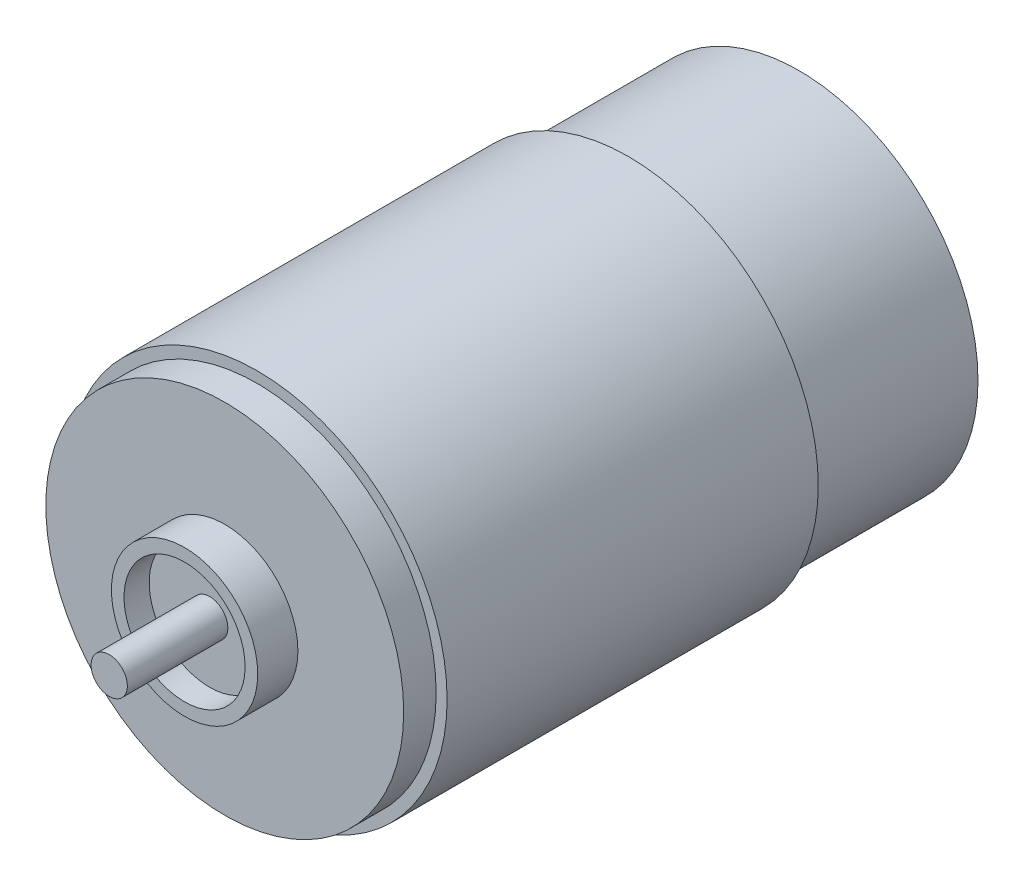
ISO-10303-21;
HEADER;
FILE_DESCRIPTION(('STEP AP214'),'2;1');
FILE_NAME('part.step','',(''),(''),'','','');
FILE_SCHEMA(('AUTOMOTIVE_DESIGN { 1 0 10303 214 1 1 1 1 }'));
ENDSEC;
DATA;
#1=APPLICATION_CONTEXT('core data for automotive mechanical design processes');
#2=APPLICATION_PROTOCOL_DEFINITION('international standard','automotive_design',2000,#1);
#3=PRODUCT_CONTEXT('',#1,'mechanical');
#4=PRODUCT('Part','Part','',(#3));
#5=PRODUCT_RELATED_PRODUCT_CATEGORY('part','',(#4));
#6=PRODUCT_DEFINITION_FORMATION('','',#4);
#7=PRODUCT_DEFINITION_CONTEXT('part definition',#1,'design');
#8=PRODUCT_DEFINITION('design','',#6,#7);
#9=PRODUCT_DEFINITION_SHAPE('','',#8);
#10=(LENGTH_UNIT() NAMED_UNIT(*) SI_UNIT(.MILLI.,.METRE.));
#11=(NAMED_UNIT(*) PLANE_ANGLE_UNIT() SI_UNIT($,.RADIAN.));
#12=(NAMED_UNIT(*) SI_UNIT($,.STERADIAN.) SOLID_ANGLE_UNIT());
#13=UNCERTAINTY_MEASURE_WITH_UNIT(LENGTH_MEASURE(1.E-05),#10,'distance_accuracy_value','');
#14=(GEOMETRIC_REPRESENTATION_CONTEXT(3) GLOBAL_UNCERTAINTY_ASSIGNED_CONTEXT((#13)) GLOBAL_UNIT_ASSIGNED_CONTEXT((#10,
#11,#12)) REPRESENTATION_CONTEXT('',''));
#15=CARTESIAN_POINT('',(0.,0.,0.));
#16=DIRECTION('',(0.,0.,1.));
#17=DIRECTION('',(1.,0.,0.));
#18=AXIS2_PLACEMENT_3D('',#15,#16,#17);
#19=CARTESIAN_POINT('',(0.,0.,36.94));
#20=DIRECTION('',(0.,0.,-1.));
#21=DIRECTION('',(-1.,0.,0.));
#22=AXIS2_PLACEMENT_3D('',#19,#20,#21);
#23=CYLINDRICAL_SURFACE('',#22,18.9);
#24=CARTESIAN_POINT('',(0.,0.,36.94));
#25=DIRECTION('',(0.,0.,1.));
#26=DIRECTION('',(1.,0.,0.));
#27=AXIS2_PLACEMENT_3D('',#24,#25,#26);
#28=CIRCLE('',#27,18.9);
#29=CARTESIAN_POINT('',(18.9,0.,36.94));
#30=VERTEX_POINT('',#29);
#31=EDGE_CURVE('E39',#30,#30,#28,.T.);
#32=ORIENTED_EDGE('',*,*,#31,.F.);
#33=EDGE_LOOP('',(#32));
#34=FACE_BOUND('',#33,.T.);
#35=CARTESIAN_POINT('',(0.,0.,0.));
#36=DIRECTION('',(0.,0.,1.));
#37=DIRECTION('',(1.,0.,0.));
#38=AXIS2_PLACEMENT_3D('',#35,#36,#37);
#39=CIRCLE('',#38,18.9);
#40=CARTESIAN_POINT('',(18.9,0.,0.));
#41=VERTEX_POINT('',#40);
#42=EDGE_CURVE('E43',#41,#41,#39,.T.);
#43=ORIENTED_EDGE('',*,*,#42,.T.);
#44=EDGE_LOOP('',(#43));
#45=FACE_BOUND('',#44,.T.);
#46=ADVANCED_FACE('F33',(#34,#45),#23,.T.);
#47=CARTESIAN_POINT('',(0.,0.,36.94));
#48=DIRECTION('',(0.,0.,1.));
#49=DIRECTION('',(1.,0.,0.));
#50=AXIS2_PLACEMENT_3D('',#47,#48,#49);
#51=PLANE('',#50);
#52=CARTESIAN_POINT('',(0.,0.,36.94));
#53=DIRECTION('',(0.,0.,1.));
#54=DIRECTION('',(1.,0.,0.));
#55=AXIS2_PLACEMENT_3D('',#52,#53,#54);
#56=CIRCLE('',#55,17.81);
#57=CARTESIAN_POINT('',(17.81,0.,36.94));
#58=VERTEX_POINT('',#57);
#59=EDGE_CURVE('E50',#58,#58,#56,.T.);
#60=ORIENTED_EDGE('',*,*,#59,.F.);
#61=EDGE_LOOP('',(#60));
#62=FACE_BOUND('',#61,.T.);
#63=ORIENTED_EDGE('',*,*,#31,.T.);
#64=EDGE_LOOP('',(#63));
#65=FACE_BOUND('',#64,.T.);
#66=ADVANCED_FACE('F154',(#62,#65),#51,.T.);
#67=CARTESIAN_POINT('',(0.,0.,0.));
#68=DIRECTION('',(0.,0.,1.));
#69=DIRECTION('',(1.,0.,0.));
#70=AXIS2_PLACEMENT_3D('',#67,#68,#69);
#71=PLANE('',#70);
#72=CARTESIAN_POINT('',(0.,0.,0.));
#73=DIRECTION('',(0.,0.,1.));
#74=DIRECTION('',(1.,0.,0.));
#75=AXIS2_PLACEMENT_3D('',#72,#73,#74);
#76=CIRCLE('',#75,17.81);
#77=CARTESIAN_POINT('',(17.81,0.,0.));
#78=VERTEX_POINT('',#77);
#79=EDGE_CURVE('E10',#78,#78,#76,.F.);
#80=ORIENTED_EDGE('',*,*,#79,.F.);
#81=EDGE_LOOP('',(#80));
#82=FACE_BOUND('',#81,.T.);
#83=ORIENTED_EDGE('',*,*,#42,.F.);
#84=EDGE_LOOP('',(#83));
#85=FACE_BOUND('',#84,.T.);
#86=ADVANCED_FACE('F150',(#82,#85),#71,.F.);
#87=CARTESIAN_POINT('',(0.,0.,40.17));
#88=DIRECTION('',(0.,0.,-1.));
#89=DIRECTION('',(-1.,0.,0.));
#90=AXIS2_PLACEMENT_3D('',#87,#88,#89);
#91=CYLINDRICAL_SURFACE('',#90,17.81);
#92=CARTESIAN_POINT('',(0.,0.,40.17));
#93=DIRECTION('',(0.,0.,1.));
#94=DIRECTION('',(1.,0.,0.));
#95=AXIS2_PLACEMENT_3D('',#92,#93,#94);
#96=CIRCLE('',#95,17.81);
#97=CARTESIAN_POINT('',(17.81,0.,40.17));
#98=VERTEX_POINT('',#97);
#99=EDGE_CURVE('E48',#98,#98,#96,.T.);
#100=ORIENTED_EDGE('',*,*,#99,.F.);
#101=EDGE_LOOP('',(#100));
#102=FACE_BOUND('',#101,.T.);
#103=ORIENTED_EDGE('',*,*,#59,.T.);
#104=EDGE_LOOP('',(#103));
#105=FACE_BOUND('',#104,.T.);
#106=ADVANCED_FACE('F144',(#102,#105),#91,.T.);
#107=CARTESIAN_POINT('',(0.,0.,40.17));
#108=DIRECTION('',(0.,0.,1.));
#109=DIRECTION('',(1.,0.,0.));
#110=AXIS2_PLACEMENT_3D('',#107,#108,#109);
#111=PLANE('',#110);
#112=CARTESIAN_POINT('',(0.,0.,40.17));
#113=DIRECTION('',(0.,0.,1.));
#114=DIRECTION('',(1.,0.,0.));
#115=AXIS2_PLACEMENT_3D('',#112,#113,#114);
#116=CIRCLE('',#115,7.28051111516107);
#117=CARTESIAN_POINT('',(7.28051111516107,0.,40.17));
#118=VERTEX_POINT('',#117);
#119=EDGE_CURVE('E89',#118,#118,#116,.T.);
#120=ORIENTED_EDGE('',*,*,#119,.F.);
#121=EDGE_LOOP('',(#120));
#122=FACE_BOUND('',#121,.T.);
#123=ORIENTED_EDGE('',*,*,#99,.T.);
#124=EDGE_LOOP('',(#123));
#125=FACE_BOUND('',#124,.T.);
#126=ADVANCED_FACE('F140',(#122,#125),#111,.T.);
#127=CARTESIAN_POINT('',(0.,0.,-16.99));
#128=DIRECTION('',(0.,0.,1.));
#129=DIRECTION('',(1.,0.,0.));
#130=AXIS2_PLACEMENT_3D('',#127,#128,#129);
#131=CYLINDRICAL_SURFACE('',#130,17.81);
#132=CARTESIAN_POINT('',(0.,0.,-16.99));
#133=DIRECTION('',(0.,0.,-1.));
#134=DIRECTION('',(-1.,0.,0.));
#135=AXIS2_PLACEMENT_3D('',#132,#133,#134);
#136=CIRCLE('',#135,17.81);
#137=CARTESIAN_POINT('',(-17.81,0.,-16.99));
#138=VERTEX_POINT('',#137);
#139=EDGE_CURVE('E53',#138,#138,#136,.T.);
#140=ORIENTED_EDGE('',*,*,#139,.F.);
#141=EDGE_LOOP('',(#140));
#142=FACE_BOUND('',#141,.T.);
#143=ORIENTED_EDGE('',*,*,#79,.T.);
#144=EDGE_LOOP('',(#143));
#145=FACE_BOUND('',#144,.T.);
#146=ADVANCED_FACE('F143',(#142,#145),#131,.T.);
#147=CARTESIAN_POINT('',(0.,0.,-16.99));
#148=DIRECTION('',(0.,0.,-1.));
#149=DIRECTION('',(-1.,0.,0.));
#150=AXIS2_PLACEMENT_3D('',#147,#148,#149);
#151=PLANE('',#150);
#152=CARTESIAN_POINT('',(0.,0.,-16.99));
#153=DIRECTION('',(0.,0.,-1.));
#154=DIRECTION('',(-1.,0.,0.));
#155=AXIS2_PLACEMENT_3D('',#152,#153,#154);
#156=CIRCLE('',#155,16.485);
#157=CARTESIAN_POINT('',(-16.485,0.,-16.99));
#158=VERTEX_POINT('',#157);
#159=EDGE_CURVE('E59',#158,#158,#156,.T.);
#160=ORIENTED_EDGE('',*,*,#159,.F.);
#161=EDGE_LOOP('',(#160));
#162=FACE_BOUND('',#161,.T.);
#163=ORIENTED_EDGE('',*,*,#139,.T.);
#164=EDGE_LOOP('',(#163));
#165=FACE_BOUND('',#164,.T.);
#166=ADVANCED_FACE('F166',(#162,#165),#151,.T.);
#167=CARTESIAN_POINT('',(0.,0.,-15.61));
#168=DIRECTION('',(0.,0.,-1.));
#169=DIRECTION('',(-1.,0.,0.));
#170=AXIS2_PLACEMENT_3D('',#167,#168,#169);
#171=CYLINDRICAL_SURFACE('',#170,16.485);
#172=CARTESIAN_POINT('',(0.,0.,-15.61));
#173=DIRECTION('',(0.,0.,-1.));
#174=DIRECTION('',(-1.,0.,0.));
#175=AXIS2_PLACEMENT_3D('',#172,#173,#174);
#176=CIRCLE('',#175,16.485);
#177=CARTESIAN_POINT('',(-16.485,0.,-15.61));
#178=VERTEX_POINT('',#177);
#179=EDGE_CURVE('E58',#178,#178,#176,.T.);
#180=ORIENTED_EDGE('',*,*,#179,.F.);
#181=EDGE_LOOP('',(#180));
#182=FACE_BOUND('',#181,.T.);
#183=ORIENTED_EDGE('',*,*,#159,.T.);
#184=EDGE_LOOP('',(#183));
#185=FACE_BOUND('',#184,.T.);
#186=ADVANCED_FACE('F170',(#182,#185),#171,.F.);
#187=CARTESIAN_POINT('',(0.,0.,-15.61));
#188=DIRECTION('',(0.,0.,-1.));
#189=DIRECTION('',(-1.,0.,0.));
#190=AXIS2_PLACEMENT_3D('',#187,#188,#189);
#191=PLANE('',#190);
#192=CARTESIAN_POINT('',(0.,0.,-15.61));
#193=DIRECTION('',(0.,0.,-1.));
#194=DIRECTION('',(-1.,0.,0.));
#195=AXIS2_PLACEMENT_3D('',#192,#193,#194);
#196=CIRCLE('',#195,12.15);
#197=CARTESIAN_POINT('',(-12.15,0.,-15.61));
#198=VERTEX_POINT('',#197);
#199=EDGE_CURVE('E65',#198,#198,#196,.T.);
#200=ORIENTED_EDGE('',*,*,#199,.F.);
#201=EDGE_LOOP('',(#200));
#202=FACE_BOUND('',#201,.T.);
#203=ORIENTED_EDGE('',*,*,#179,.T.);
#204=EDGE_LOOP('',(#203));
#205=FACE_BOUND('',#204,.T.);
#206=ADVANCED_FACE('F174',(#202,#205),#191,.T.);
#207=CARTESIAN_POINT('',(0.,0.,-16.61));
#208=DIRECTION('',(0.,0.,1.));
#209=DIRECTION('',(1.,0.,0.));
#210=AXIS2_PLACEMENT_3D('',#207,#208,#209);
#211=CYLINDRICAL_SURFACE('',#210,12.15);
#212=CARTESIAN_POINT('',(0.,0.,-16.61));
#213=DIRECTION('',(0.,0.,-1.));
#214=DIRECTION('',(-1.,0.,0.));
#215=AXIS2_PLACEMENT_3D('',#212,#213,#214);
#216=CIRCLE('',#215,12.15);
#217=CARTESIAN_POINT('',(-12.15,0.,-16.61));
#218=VERTEX_POINT('',#217);
#219=EDGE_CURVE('E62',#218,#218,#216,.T.);
#220=ORIENTED_EDGE('',*,*,#219,.F.);
#221=EDGE_LOOP('',(#220));
#222=FACE_BOUND('',#221,.T.);
#223=ORIENTED_EDGE('',*,*,#199,.T.);
#224=EDGE_LOOP('',(#223));
#225=FACE_BOUND('',#224,.T.);
#226=ADVANCED_FACE('F178',(#222,#225),#211,.T.);
#227=CARTESIAN_POINT('',(0.,0.,-16.61));
#228=DIRECTION('',(0.,0.,-1.));
#229=DIRECTION('',(-1.,0.,0.));
#230=AXIS2_PLACEMENT_3D('',#227,#228,#229);
#231=PLANE('',#230);
#232=CARTESIAN_POINT('',(0.,0.,-16.61));
#233=DIRECTION('',(0.,0.,-1.));
#234=DIRECTION('',(-1.,0.,0.));
#235=AXIS2_PLACEMENT_3D('',#232,#233,#234);
#236=CIRCLE('',#235,5.125);
#237=CARTESIAN_POINT('',(-5.125,0.,-16.61));
#238=VERTEX_POINT('',#237);
#239=EDGE_CURVE('E71',#238,#238,#236,.T.);
#240=ORIENTED_EDGE('',*,*,#239,.F.);
#241=EDGE_LOOP('',(#240));
#242=FACE_BOUND('',#241,.T.);
#243=ORIENTED_EDGE('',*,*,#219,.T.);
#244=EDGE_LOOP('',(#243));
#245=FACE_BOUND('',#244,.T.);
#246=ADVANCED_FACE('F182',(#242,#245),#231,.T.);
#247=CARTESIAN_POINT('',(0.,0.,-20.61));
#248=DIRECTION('',(0.,0.,1.));
#249=DIRECTION('',(1.,0.,0.));
#250=AXIS2_PLACEMENT_3D('',#247,#248,#249);
#251=CYLINDRICAL_SURFACE('',#250,5.125);
#252=CARTESIAN_POINT('',(0.,0.,-20.61));
#253=DIRECTION('',(0.,0.,-1.));
#254=DIRECTION('',(-1.,0.,0.));
#255=AXIS2_PLACEMENT_3D('',#252,#253,#254);
#256=CIRCLE('',#255,5.125);
#257=CARTESIAN_POINT('',(-5.125,0.,-20.61));
#258=VERTEX_POINT('',#257);
#259=EDGE_CURVE('E68',#258,#258,#256,.T.);
#260=ORIENTED_EDGE('',*,*,#259,.F.);
#261=EDGE_LOOP('',(#260));
#262=FACE_BOUND('',#261,.T.);
#263=ORIENTED_EDGE('',*,*,#239,.T.);
#264=EDGE_LOOP('',(#263));
#265=FACE_BOUND('',#264,.T.);
#266=ADVANCED_FACE('F186',(#262,#265),#251,.T.);
#267=CARTESIAN_POINT('',(0.,0.,-20.61));
#268=DIRECTION('',(0.,0.,-1.));
#269=DIRECTION('',(-1.,0.,0.));
#270=AXIS2_PLACEMENT_3D('',#267,#268,#269);
#271=PLANE('',#270);
#272=CARTESIAN_POINT('',(0.,0.,-20.61));
#273=DIRECTION('',(0.,0.,-1.));
#274=DIRECTION('',(-1.,0.,0.));
#275=AXIS2_PLACEMENT_3D('',#272,#273,#274);
#276=CIRCLE('',#275,4.49987443997912);
#277=CARTESIAN_POINT('',(-4.49987443997912,0.,-20.61));
#278=VERTEX_POINT('',#277);
#279=EDGE_CURVE('E77',#278,#278,#276,.T.);
#280=ORIENTED_EDGE('',*,*,#279,.F.);
#281=EDGE_LOOP('',(#280));
#282=FACE_BOUND('',#281,.T.);
#283=ORIENTED_EDGE('',*,*,#259,.T.);
#284=EDGE_LOOP('',(#283));
#285=FACE_BOUND('',#284,.T.);
#286=ADVANCED_FACE('F190',(#282,#285),#271,.T.);
#287=CARTESIAN_POINT('',(0.,0.,-19.61));
#288=DIRECTION('',(0.,0.,-1.));
#289=DIRECTION('',(-1.,0.,0.));
#290=AXIS2_PLACEMENT_3D('',#287,#288,#289);
#291=CYLINDRICAL_SURFACE('',#290,4.49987443997912);
#292=CARTESIAN_POINT('',(0.,0.,-19.61));
#293=DIRECTION('',(0.,0.,-1.));
#294=DIRECTION('',(-1.,0.,0.));
#295=AXIS2_PLACEMENT_3D('',#292,#293,#294);
#296=CIRCLE('',#295,4.49987443997912);
#297=CARTESIAN_POINT('',(-4.49987443997912,0.,-19.61));
#298=VERTEX_POINT('',#297);
#299=EDGE_CURVE('E74',#298,#298,#296,.T.);
#300=ORIENTED_EDGE('',*,*,#299,.F.);
#301=EDGE_LOOP('',(#300));
#302=FACE_BOUND('',#301,.T.);
#303=ORIENTED_EDGE('',*,*,#279,.T.);
#304=EDGE_LOOP('',(#303));
#305=FACE_BOUND('',#304,.T.);
#306=ADVANCED_FACE('F194',(#302,#305),#291,.F.);
#307=CARTESIAN_POINT('',(0.,0.,-19.61));
#308=DIRECTION('',(0.,0.,-1.));
#309=DIRECTION('',(-1.,0.,0.));
#310=AXIS2_PLACEMENT_3D('',#307,#308,#309);
#311=PLANE('',#310);
#312=CARTESIAN_POINT('',(0.,0.,-19.61));
#313=DIRECTION('',(0.,0.,-1.));
#314=DIRECTION('',(-1.,0.,0.));
#315=AXIS2_PLACEMENT_3D('',#312,#313,#314);
#316=CIRCLE('',#315,1.27520766375078);
#317=CARTESIAN_POINT('',(-1.27520766375078,0.,-19.61));
#318=VERTEX_POINT('',#317);
#319=EDGE_CURVE('E83',#318,#318,#316,.T.);
#320=ORIENTED_EDGE('',*,*,#319,.F.);
#321=EDGE_LOOP('',(#320));
#322=FACE_BOUND('',#321,.T.);
#323=ORIENTED_EDGE('',*,*,#299,.T.);
#324=EDGE_LOOP('',(#323));
#325=FACE_BOUND('',#324,.T.);
#326=ADVANCED_FACE('F198',(#322,#325),#311,.T.);
#327=CARTESIAN_POINT('',(0.,0.,-23.61));
#328=DIRECTION('',(0.,0.,1.));
#329=DIRECTION('',(1.,0.,0.));
#330=AXIS2_PLACEMENT_3D('',#327,#328,#329);
#331=CYLINDRICAL_SURFACE('',#330,1.27520766375078);
#332=CARTESIAN_POINT('',(0.,0.,-23.61));
#333=DIRECTION('',(0.,0.,-1.));
#334=DIRECTION('',(-1.,0.,0.));
#335=AXIS2_PLACEMENT_3D('',#332,#333,#334);
#336=CIRCLE('',#335,1.27520766375078);
#337=CARTESIAN_POINT('',(-1.27520766375078,0.,-23.61));
#338=VERTEX_POINT('',#337);
#339=EDGE_CURVE('E80',#338,#338,#336,.T.);
#340=ORIENTED_EDGE('',*,*,#339,.F.);
#341=EDGE_LOOP('',(#340));
#342=FACE_BOUND('',#341,.T.);
#343=ORIENTED_EDGE('',*,*,#319,.T.);
#344=EDGE_LOOP('',(#343));
#345=FACE_BOUND('',#344,.T.);
#346=ADVANCED_FACE('F202',(#342,#345),#331,.T.);
#347=CARTESIAN_POINT('',(0.,0.,-23.61));
#348=DIRECTION('',(0.,0.,-1.));
#349=DIRECTION('',(-1.,0.,0.));
#350=AXIS2_PLACEMENT_3D('',#347,#348,#349);
#351=PLANE('',#350);
#352=ORIENTED_EDGE('',*,*,#339,.T.);
#353=EDGE_LOOP('',(#352));
#354=FACE_BOUND('',#353,.T.);
#355=ADVANCED_FACE('F136',(#354),#351,.T.);
#356=CARTESIAN_POINT('',(0.,0.,44.17));
#357=DIRECTION('',(0.,0.,-1.));
#358=DIRECTION('',(-1.,0.,0.));
#359=AXIS2_PLACEMENT_3D('',#356,#357,#358);
#360=CYLINDRICAL_SURFACE('',#359,7.28051111516107);
#361=CARTESIAN_POINT('',(0.,0.,44.17));
#362=DIRECTION('',(0.,0.,1.));
#363=DIRECTION('',(1.,0.,0.));
#364=AXIS2_PLACEMENT_3D('',#361,#362,#363);
#365=CIRCLE('',#364,7.28051111516107);
#366=CARTESIAN_POINT('',(7.28051111516107,0.,44.17));
#367=VERTEX_POINT('',#366);
#368=EDGE_CURVE('E86',#367,#367,#365,.T.);
#369=ORIENTED_EDGE('',*,*,#368,.F.);
#370=EDGE_LOOP('',(#369));
#371=FACE_BOUND('',#370,.T.);
#372=ORIENTED_EDGE('',*,*,#119,.T.);
#373=EDGE_LOOP('',(#372));
#374=FACE_BOUND('',#373,.T.);
#375=ADVANCED_FACE('F130',(#371,#374),#360,.T.);
#376=CARTESIAN_POINT('',(0.,0.,44.17));
#377=DIRECTION('',(0.,0.,1.));
#378=DIRECTION('',(1.,0.,0.));
#379=AXIS2_PLACEMENT_3D('',#376,#377,#378);
#380=PLANE('',#379);
#381=CARTESIAN_POINT('',(0.,0.,44.17));
#382=DIRECTION('',(0.,0.,1.));
#383=DIRECTION('',(1.,0.,0.));
#384=AXIS2_PLACEMENT_3D('',#381,#382,#383);
#385=CIRCLE('',#384,6.02408991737076);
#386=CARTESIAN_POINT('',(6.02408991737076,0.,44.17));
#387=VERTEX_POINT('',#386);
#388=EDGE_CURVE('E95',#387,#387,#385,.T.);
#389=ORIENTED_EDGE('',*,*,#388,.F.);
#390=EDGE_LOOP('',(#389));
#391=FACE_BOUND('',#390,.T.);
#392=ORIENTED_EDGE('',*,*,#368,.T.);
#393=EDGE_LOOP('',(#392));
#394=FACE_BOUND('',#393,.T.);
#395=ADVANCED_FACE('F124',(#391,#394),#380,.T.);
#396=CARTESIAN_POINT('',(0.,0.,41.67));
#397=DIRECTION('',(0.,0.,1.));
#398=DIRECTION('',(1.,0.,0.));
#399=AXIS2_PLACEMENT_3D('',#396,#397,#398);
#400=CYLINDRICAL_SURFACE('',#399,6.02408991737076);
#401=CARTESIAN_POINT('',(0.,0.,41.67));
#402=DIRECTION('',(0.,0.,1.));
#403=DIRECTION('',(1.,0.,0.));
#404=AXIS2_PLACEMENT_3D('',#401,#402,#403);
#405=CIRCLE('',#404,6.02408991737076);
#406=CARTESIAN_POINT('',(6.02408991737076,0.,41.67));
#407=VERTEX_POINT('',#406);
#408=EDGE_CURVE('E92',#407,#407,#405,.T.);
#409=ORIENTED_EDGE('',*,*,#408,.F.);
#410=EDGE_LOOP('',(#409));
#411=FACE_BOUND('',#410,.T.);
#412=ORIENTED_EDGE('',*,*,#388,.T.);
#413=EDGE_LOOP('',(#412));
#414=FACE_BOUND('',#413,.T.);
#415=ADVANCED_FACE('F118',(#411,#414),#400,.F.);
#416=CARTESIAN_POINT('',(0.,0.,41.67));
#417=DIRECTION('',(0.,0.,1.));
#418=DIRECTION('',(1.,0.,0.));
#419=AXIS2_PLACEMENT_3D('',#416,#417,#418);
#420=PLANE('',#419);
#421=CARTESIAN_POINT('',(0.,0.,41.67));
#422=DIRECTION('',(0.,0.,1.));
#423=DIRECTION('',(1.,0.,0.));
#424=AXIS2_PLACEMENT_3D('',#421,#422,#423);
#425=CIRCLE('',#424,1.80527295354116);
#426=CARTESIAN_POINT('',(1.80527295354116,0.,41.67));
#427=VERTEX_POINT('',#426);
#428=EDGE_CURVE('E101',#427,#427,#425,.T.);
#429=ORIENTED_EDGE('',*,*,#428,.F.);
#430=EDGE_LOOP('',(#429));
#431=FACE_BOUND('',#430,.T.);
#432=ORIENTED_EDGE('',*,*,#408,.T.);
#433=EDGE_LOOP('',(#432));
#434=FACE_BOUND('',#433,.T.);
#435=ADVANCED_FACE('F112',(#431,#434),#420,.T.);
#436=CARTESIAN_POINT('',(0.,0.,51.67));
#437=DIRECTION('',(0.,0.,-1.));
#438=DIRECTION('',(-1.,0.,0.));
#439=AXIS2_PLACEMENT_3D('',#436,#437,#438);
#440=CYLINDRICAL_SURFACE('',#439,1.80527295354116);
#441=CARTESIAN_POINT('',(0.,0.,51.67));
#442=DIRECTION('',(0.,0.,1.));
#443=DIRECTION('',(1.,0.,0.));
#444=AXIS2_PLACEMENT_3D('',#441,#442,#443);
#445=CIRCLE('',#444,1.80527295354116);
#446=CARTESIAN_POINT('',(1.80527295354116,0.,51.67));
#447=VERTEX_POINT('',#446);
#448=EDGE_CURVE('E98',#447,#447,#445,.T.);
#449=ORIENTED_EDGE('',*,*,#448,.F.);
#450=EDGE_LOOP('',(#449));
#451=FACE_BOUND('',#450,.T.);
#452=ORIENTED_EDGE('',*,*,#428,.T.);
#453=EDGE_LOOP('',(#452));
#454=FACE_BOUND('',#453,.T.);
#455=ADVANCED_FACE('F109',(#451,#454),#440,.T.);
#456=CARTESIAN_POINT('',(0.,0.,51.67));
#457=DIRECTION('',(0.,0.,1.));
#458=DIRECTION('',(1.,0.,0.));
#459=AXIS2_PLACEMENT_3D('',#456,#457,#458);
#460=PLANE('',#459);
#461=ORIENTED_EDGE('',*,*,#448,.T.);
#462=EDGE_LOOP('',(#461));
#463=FACE_BOUND('',#462,.T.);
#464=ADVANCED_FACE('F107',(#463),#460,.T.);
#465=CLOSED_SHELL('',(#46,#66,#86,#106,#126,#146,#166,#186,#206,#226,#246,#266,#286,#306,#326,
#346,#355,#375,#395,#415,#435,#455,#464));
#466=MANIFOLD_SOLID_BREP('B2',#465);
#467=ADVANCED_BREP_SHAPE_REPRESENTATION('',(#18,#466),#14);
#468=SHAPE_DEFINITION_REPRESENTATION(#9,#467);
ENDSEC;
END-ISO-10303-21;
